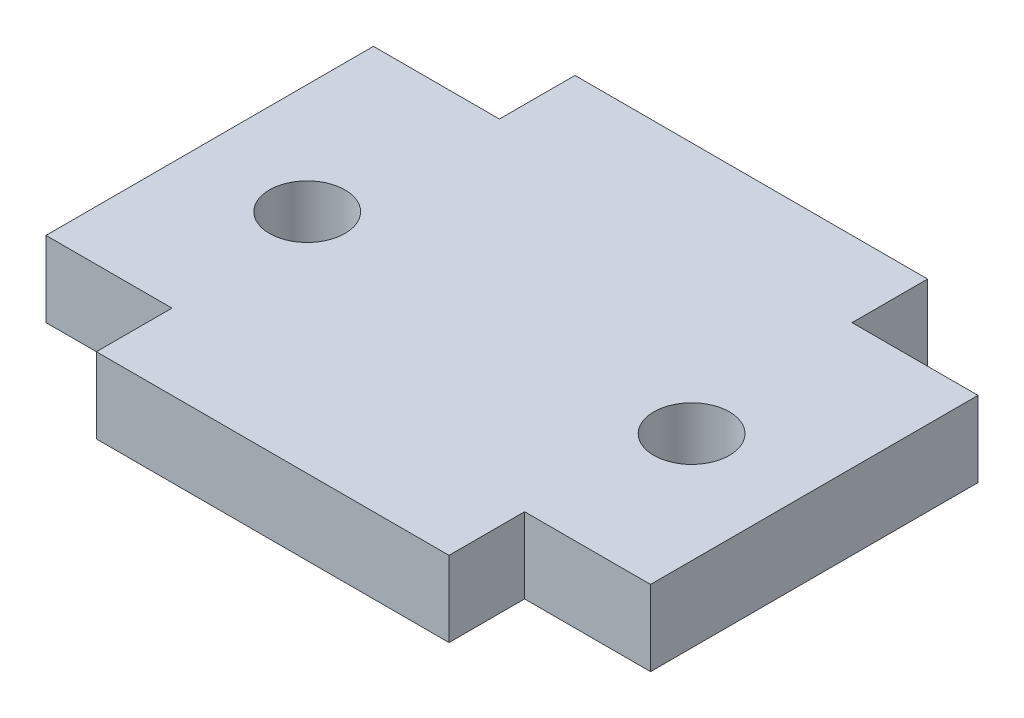
ISO-10303-21;
HEADER;
FILE_DESCRIPTION(('STEP AP214'),'2;1');
FILE_NAME('part.step','',(''),(''),'','','');
FILE_SCHEMA(('AUTOMOTIVE_DESIGN { 1 0 10303 214 1 1 1 1 }'));
ENDSEC;
DATA;
#1=APPLICATION_CONTEXT('core data for automotive mechanical design processes');
#2=APPLICATION_PROTOCOL_DEFINITION('international standard','automotive_design',2000,#1);
#3=PRODUCT_CONTEXT('',#1,'mechanical');
#4=PRODUCT('Part','Part','',(#3));
#5=PRODUCT_RELATED_PRODUCT_CATEGORY('part','',(#4));
#6=PRODUCT_DEFINITION_FORMATION('','',#4);
#7=PRODUCT_DEFINITION_CONTEXT('part definition',#1,'design');
#8=PRODUCT_DEFINITION('design','',#6,#7);
#9=PRODUCT_DEFINITION_SHAPE('','',#8);
#10=(LENGTH_UNIT() NAMED_UNIT(*) SI_UNIT(.MILLI.,.METRE.));
#11=(NAMED_UNIT(*) PLANE_ANGLE_UNIT() SI_UNIT($,.RADIAN.));
#12=(NAMED_UNIT(*) SI_UNIT($,.STERADIAN.) SOLID_ANGLE_UNIT());
#13=UNCERTAINTY_MEASURE_WITH_UNIT(LENGTH_MEASURE(1.E-05),#10,'distance_accuracy_value','');
#14=(GEOMETRIC_REPRESENTATION_CONTEXT(3) GLOBAL_UNCERTAINTY_ASSIGNED_CONTEXT((#13)) GLOBAL_UNIT_ASSIGNED_CONTEXT((#10,
#11,#12)) REPRESENTATION_CONTEXT('',''));
#15=CARTESIAN_POINT('',(0.,0.,0.));
#16=DIRECTION('',(0.,0.,1.));
#17=DIRECTION('',(1.,0.,0.));
#18=AXIS2_PLACEMENT_3D('',#15,#16,#17);
#19=CARTESIAN_POINT('',(0.,3.,0.));
#20=DIRECTION('',(0.,-1.,0.));
#21=DIRECTION('',(0.,0.,-1.));
#22=AXIS2_PLACEMENT_3D('',#19,#20,#21);
#23=PLANE('',#22);
#24=DIRECTION('',(1.,0.,0.));
#25=VECTOR('',#24,1.);
#26=CARTESIAN_POINT('',(5.,3.,0.));
#27=LINE('',#26,#25);
#28=CARTESIAN_POINT('',(0.,3.,0.));
#29=VERTEX_POINT('',#28);
#30=CARTESIAN_POINT('',(5.,3.,0.));
#31=VERTEX_POINT('',#30);
#32=EDGE_CURVE('E176',#29,#31,#27,.T.);
#33=ORIENTED_EDGE('',*,*,#32,.T.);
#34=DIRECTION('',(0.,0.,1.));
#35=VECTOR('',#34,1.);
#36=CARTESIAN_POINT('',(5.,3.,3.));
#37=LINE('',#36,#35);
#38=CARTESIAN_POINT('',(5.,3.,3.));
#39=VERTEX_POINT('',#38);
#40=EDGE_CURVE('E104',#31,#39,#37,.T.);
#41=ORIENTED_EDGE('',*,*,#40,.T.);
#42=DIRECTION('',(1.,0.,0.));
#43=VECTOR('',#42,1.);
#44=CARTESIAN_POINT('',(5.,3.,3.));
#45=LINE('',#44,#43);
#46=CARTESIAN_POINT('',(19.,3.,3.));
#47=VERTEX_POINT('',#46);
#48=EDGE_CURVE('E203',#39,#47,#45,.T.);
#49=ORIENTED_EDGE('',*,*,#48,.T.);
#50=DIRECTION('',(0.,0.,-1.));
#51=VECTOR('',#50,1.);
#52=CARTESIAN_POINT('',(19.,3.,3.));
#53=LINE('',#52,#51);
#54=CARTESIAN_POINT('',(19.,3.,0.));
#55=VERTEX_POINT('',#54);
#56=EDGE_CURVE('E222',#47,#55,#53,.T.);
#57=ORIENTED_EDGE('',*,*,#56,.T.);
#58=DIRECTION('',(1.,0.,0.));
#59=VECTOR('',#58,1.);
#60=CARTESIAN_POINT('',(24.,3.,0.));
#61=LINE('',#60,#59);
#62=CARTESIAN_POINT('',(24.,3.,0.));
#63=VERTEX_POINT('',#62);
#64=EDGE_CURVE('E219',#55,#63,#61,.T.);
#65=ORIENTED_EDGE('',*,*,#64,.T.);
#66=DIRECTION('',(0.,0.,-1.));
#67=VECTOR('',#66,1.);
#68=CARTESIAN_POINT('',(24.,3.,-13.));
#69=LINE('',#68,#67);
#70=CARTESIAN_POINT('',(24.,3.,-13.));
#71=VERTEX_POINT('',#70);
#72=EDGE_CURVE('E221',#63,#71,#69,.T.);
#73=ORIENTED_EDGE('',*,*,#72,.T.);
#74=DIRECTION('',(-1.,0.,0.));
#75=VECTOR('',#74,1.);
#76=CARTESIAN_POINT('',(19.,3.,-13.));
#77=LINE('',#76,#75);
#78=CARTESIAN_POINT('',(19.,3.,-13.));
#79=VERTEX_POINT('',#78);
#80=EDGE_CURVE('E224',#71,#79,#77,.T.);
#81=ORIENTED_EDGE('',*,*,#80,.T.);
#82=DIRECTION('',(0.,0.,-1.));
#83=VECTOR('',#82,1.);
#84=CARTESIAN_POINT('',(19.,3.,-16.));
#85=LINE('',#84,#83);
#86=CARTESIAN_POINT('',(19.,3.,-16.));
#87=VERTEX_POINT('',#86);
#88=EDGE_CURVE('E230',#79,#87,#85,.T.);
#89=ORIENTED_EDGE('',*,*,#88,.T.);
#90=DIRECTION('',(-1.,0.,0.));
#91=VECTOR('',#90,1.);
#92=CARTESIAN_POINT('',(5.,3.,-16.));
#93=LINE('',#92,#91);
#94=CARTESIAN_POINT('',(5.,3.,-16.));
#95=VERTEX_POINT('',#94);
#96=EDGE_CURVE('E135',#87,#95,#93,.T.);
#97=ORIENTED_EDGE('',*,*,#96,.T.);
#98=DIRECTION('',(0.,0.,1.));
#99=VECTOR('',#98,1.);
#100=CARTESIAN_POINT('',(5.,3.,-16.));
#101=LINE('',#100,#99);
#102=CARTESIAN_POINT('',(5.,3.,-13.));
#103=VERTEX_POINT('',#102);
#104=EDGE_CURVE('E129',#95,#103,#101,.T.);
#105=ORIENTED_EDGE('',*,*,#104,.T.);
#106=DIRECTION('',(-1.,0.,0.));
#107=VECTOR('',#106,1.);
#108=CARTESIAN_POINT('',(0.,3.,-13.));
#109=LINE('',#108,#107);
#110=CARTESIAN_POINT('',(0.,3.,-13.));
#111=VERTEX_POINT('',#110);
#112=EDGE_CURVE('E133',#103,#111,#109,.T.);
#113=ORIENTED_EDGE('',*,*,#112,.T.);
#114=DIRECTION('',(0.,0.,1.));
#115=VECTOR('',#114,1.);
#116=CARTESIAN_POINT('',(0.,3.,0.));
#117=LINE('',#116,#115);
#118=EDGE_CURVE('E49',#111,#29,#117,.T.);
#119=ORIENTED_EDGE('',*,*,#118,.T.);
#120=EDGE_LOOP('',(#33,#41,#49,#57,#65,#73,#81,#89,#97,#105,#113,#119));
#121=FACE_BOUND('',#120,.T.);
#122=CARTESIAN_POINT('',(4.37,3.,-6.));
#123=DIRECTION('',(0.,1.,0.));
#124=DIRECTION('',(0.,0.,1.));
#125=AXIS2_PLACEMENT_3D('',#122,#123,#124);
#126=CIRCLE('',#125,1.5);
#127=CARTESIAN_POINT('',(4.37,3.,-4.5));
#128=VERTEX_POINT('',#127);
#129=EDGE_CURVE('E157',#128,#128,#126,.T.);
#130=ORIENTED_EDGE('',*,*,#129,.F.);
#131=EDGE_LOOP('',(#130));
#132=FACE_BOUND('',#131,.T.);
#133=CARTESIAN_POINT('',(19.63,3.,-6.));
#134=DIRECTION('',(0.,1.,0.));
#135=DIRECTION('',(0.,0.,-1.));
#136=AXIS2_PLACEMENT_3D('',#133,#134,#135);
#137=CIRCLE('',#136,1.5);
#138=CARTESIAN_POINT('',(19.63,3.,-7.5));
#139=VERTEX_POINT('',#138);
#140=EDGE_CURVE('E271',#139,#139,#137,.T.);
#141=ORIENTED_EDGE('',*,*,#140,.F.);
#142=EDGE_LOOP('',(#141));
#143=FACE_BOUND('',#142,.T.);
#144=ADVANCED_FACE('F32',(#121,#132,#143),#23,.F.);
#145=CARTESIAN_POINT('',(0.,0.,0.));
#146=DIRECTION('',(0.,-1.,0.));
#147=DIRECTION('',(0.,0.,-1.));
#148=AXIS2_PLACEMENT_3D('',#145,#146,#147);
#149=PLANE('',#148);
#150=CARTESIAN_POINT('',(4.37,0.,-6.));
#151=DIRECTION('',(0.,1.,0.));
#152=DIRECTION('',(0.,0.,1.));
#153=AXIS2_PLACEMENT_3D('',#150,#151,#152);
#154=CIRCLE('',#153,1.5);
#155=CARTESIAN_POINT('',(4.37,0.,-4.5));
#156=VERTEX_POINT('',#155);
#157=EDGE_CURVE('E276',#156,#156,#154,.T.);
#158=ORIENTED_EDGE('',*,*,#157,.T.);
#159=EDGE_LOOP('',(#158));
#160=FACE_BOUND('',#159,.T.);
#161=DIRECTION('',(1.,0.,0.));
#162=VECTOR('',#161,1.);
#163=CARTESIAN_POINT('',(5.,0.,0.));
#164=LINE('',#163,#162);
#165=CARTESIAN_POINT('',(0.,0.,0.));
#166=VERTEX_POINT('',#165);
#167=CARTESIAN_POINT('',(5.,0.,0.));
#168=VERTEX_POINT('',#167);
#169=EDGE_CURVE('E153',#166,#168,#164,.T.);
#170=ORIENTED_EDGE('',*,*,#169,.F.);
#171=DIRECTION('',(0.,0.,1.));
#172=VECTOR('',#171,1.);
#173=CARTESIAN_POINT('',(0.,0.,0.));
#174=LINE('',#173,#172);
#175=CARTESIAN_POINT('',(0.,0.,-13.));
#176=VERTEX_POINT('',#175);
#177=EDGE_CURVE('E96',#176,#166,#174,.T.);
#178=ORIENTED_EDGE('',*,*,#177,.F.);
#179=DIRECTION('',(-1.,0.,0.));
#180=VECTOR('',#179,1.);
#181=CARTESIAN_POINT('',(0.,0.,-13.));
#182=LINE('',#181,#180);
#183=CARTESIAN_POINT('',(5.,0.,-13.));
#184=VERTEX_POINT('',#183);
#185=EDGE_CURVE('E90',#184,#176,#182,.T.);
#186=ORIENTED_EDGE('',*,*,#185,.F.);
#187=DIRECTION('',(0.,0.,1.));
#188=VECTOR('',#187,1.);
#189=CARTESIAN_POINT('',(5.,0.,-16.));
#190=LINE('',#189,#188);
#191=CARTESIAN_POINT('',(5.,0.,-16.));
#192=VERTEX_POINT('',#191);
#193=EDGE_CURVE('E143',#192,#184,#190,.T.);
#194=ORIENTED_EDGE('',*,*,#193,.F.);
#195=DIRECTION('',(-1.,0.,0.));
#196=VECTOR('',#195,1.);
#197=CARTESIAN_POINT('',(5.,0.,-16.));
#198=LINE('',#197,#196);
#199=CARTESIAN_POINT('',(19.,0.,-16.));
#200=VERTEX_POINT('',#199);
#201=EDGE_CURVE('E171',#200,#192,#198,.T.);
#202=ORIENTED_EDGE('',*,*,#201,.F.);
#203=DIRECTION('',(0.,0.,-1.));
#204=VECTOR('',#203,1.);
#205=CARTESIAN_POINT('',(19.,0.,-16.));
#206=LINE('',#205,#204);
#207=CARTESIAN_POINT('',(19.,0.,-13.));
#208=VERTEX_POINT('',#207);
#209=EDGE_CURVE('E169',#208,#200,#206,.T.);
#210=ORIENTED_EDGE('',*,*,#209,.F.);
#211=DIRECTION('',(-1.,0.,0.));
#212=VECTOR('',#211,1.);
#213=CARTESIAN_POINT('',(19.,0.,-13.));
#214=LINE('',#213,#212);
#215=CARTESIAN_POINT('',(24.,0.,-13.));
#216=VERTEX_POINT('',#215);
#217=EDGE_CURVE('E167',#216,#208,#214,.T.);
#218=ORIENTED_EDGE('',*,*,#217,.F.);
#219=DIRECTION('',(0.,0.,-1.));
#220=VECTOR('',#219,1.);
#221=CARTESIAN_POINT('',(24.,0.,-13.));
#222=LINE('',#221,#220);
#223=CARTESIAN_POINT('',(24.,0.,0.));
#224=VERTEX_POINT('',#223);
#225=EDGE_CURVE('E165',#224,#216,#222,.T.);
#226=ORIENTED_EDGE('',*,*,#225,.F.);
#227=DIRECTION('',(1.,0.,0.));
#228=VECTOR('',#227,1.);
#229=CARTESIAN_POINT('',(24.,0.,0.));
#230=LINE('',#229,#228);
#231=CARTESIAN_POINT('',(19.,0.,0.));
#232=VERTEX_POINT('',#231);
#233=EDGE_CURVE('E163',#232,#224,#230,.T.);
#234=ORIENTED_EDGE('',*,*,#233,.F.);
#235=DIRECTION('',(0.,0.,-1.));
#236=VECTOR('',#235,1.);
#237=CARTESIAN_POINT('',(19.,0.,3.));
#238=LINE('',#237,#236);
#239=CARTESIAN_POINT('',(19.,0.,3.));
#240=VERTEX_POINT('',#239);
#241=EDGE_CURVE('E161',#240,#232,#238,.T.);
#242=ORIENTED_EDGE('',*,*,#241,.F.);
#243=DIRECTION('',(1.,0.,0.));
#244=VECTOR('',#243,1.);
#245=CARTESIAN_POINT('',(5.,0.,3.));
#246=LINE('',#245,#244);
#247=CARTESIAN_POINT('',(5.,0.,3.));
#248=VERTEX_POINT('',#247);
#249=EDGE_CURVE('E159',#248,#240,#246,.T.);
#250=ORIENTED_EDGE('',*,*,#249,.F.);
#251=DIRECTION('',(0.,0.,1.));
#252=VECTOR('',#251,1.);
#253=CARTESIAN_POINT('',(5.,0.,3.));
#254=LINE('',#253,#252);
#255=EDGE_CURVE('E156',#168,#248,#254,.T.);
#256=ORIENTED_EDGE('',*,*,#255,.F.);
#257=EDGE_LOOP('',(#170,#178,#186,#194,#202,#210,#218,#226,#234,#242,#250,#256));
#258=FACE_BOUND('',#257,.T.);
#259=CARTESIAN_POINT('',(19.63,0.,-6.));
#260=DIRECTION('',(0.,1.,0.));
#261=DIRECTION('',(0.,0.,-1.));
#262=AXIS2_PLACEMENT_3D('',#259,#260,#261);
#263=CIRCLE('',#262,1.5);
#264=CARTESIAN_POINT('',(19.63,0.,-7.5));
#265=VERTEX_POINT('',#264);
#266=EDGE_CURVE('E274',#265,#265,#263,.T.);
#267=ORIENTED_EDGE('',*,*,#266,.T.);
#268=EDGE_LOOP('',(#267));
#269=FACE_BOUND('',#268,.T.);
#270=ADVANCED_FACE('F207',(#160,#258,#269),#149,.T.);
#271=CARTESIAN_POINT('',(5.,3.,0.));
#272=DIRECTION('',(0.,0.,-1.));
#273=DIRECTION('',(-1.,0.,0.));
#274=AXIS2_PLACEMENT_3D('',#271,#272,#273);
#275=PLANE('',#274);
#276=ORIENTED_EDGE('',*,*,#169,.T.);
#277=DIRECTION('',(0.,-1.,0.));
#278=VECTOR('',#277,1.);
#279=CARTESIAN_POINT('',(5.,3.,0.));
#280=LINE('',#279,#278);
#281=EDGE_CURVE('E11',#31,#168,#280,.T.);
#282=ORIENTED_EDGE('',*,*,#281,.F.);
#283=ORIENTED_EDGE('',*,*,#32,.F.);
#284=DIRECTION('',(0.,-1.,0.));
#285=VECTOR('',#284,1.);
#286=CARTESIAN_POINT('',(0.,3.,0.));
#287=LINE('',#286,#285);
#288=EDGE_CURVE('E149',#29,#166,#287,.T.);
#289=ORIENTED_EDGE('',*,*,#288,.T.);
#290=EDGE_LOOP('',(#276,#282,#283,#289));
#291=FACE_BOUND('',#290,.T.);
#292=ADVANCED_FACE('F34',(#291),#275,.F.);
#293=CARTESIAN_POINT('',(5.,3.,3.));
#294=DIRECTION('',(1.,0.,0.));
#295=DIRECTION('',(0.,0.,-1.));
#296=AXIS2_PLACEMENT_3D('',#293,#294,#295);
#297=PLANE('',#296);
#298=ORIENTED_EDGE('',*,*,#255,.T.);
#299=DIRECTION('',(0.,-1.,0.));
#300=VECTOR('',#299,1.);
#301=CARTESIAN_POINT('',(5.,3.,3.));
#302=LINE('',#301,#300);
#303=EDGE_CURVE('E41',#39,#248,#302,.T.);
#304=ORIENTED_EDGE('',*,*,#303,.F.);
#305=ORIENTED_EDGE('',*,*,#40,.F.);
#306=ORIENTED_EDGE('',*,*,#281,.T.);
#307=EDGE_LOOP('',(#298,#304,#305,#306));
#308=FACE_BOUND('',#307,.T.);
#309=ADVANCED_FACE('F371',(#308),#297,.F.);
#310=CARTESIAN_POINT('',(5.,3.,3.));
#311=DIRECTION('',(0.,0.,-1.));
#312=DIRECTION('',(-1.,0.,0.));
#313=AXIS2_PLACEMENT_3D('',#310,#311,#312);
#314=PLANE('',#313);
#315=ORIENTED_EDGE('',*,*,#249,.T.);
#316=DIRECTION('',(0.,-1.,0.));
#317=VECTOR('',#316,1.);
#318=CARTESIAN_POINT('',(19.,3.,3.));
#319=LINE('',#318,#317);
#320=EDGE_CURVE('E195',#47,#240,#319,.T.);
#321=ORIENTED_EDGE('',*,*,#320,.F.);
#322=ORIENTED_EDGE('',*,*,#48,.F.);
#323=ORIENTED_EDGE('',*,*,#303,.T.);
#324=EDGE_LOOP('',(#315,#321,#322,#323));
#325=FACE_BOUND('',#324,.T.);
#326=ADVANCED_FACE('F201',(#325),#314,.F.);
#327=CARTESIAN_POINT('',(19.,3.,3.));
#328=DIRECTION('',(-1.,0.,0.));
#329=DIRECTION('',(0.,0.,1.));
#330=AXIS2_PLACEMENT_3D('',#327,#328,#329);
#331=PLANE('',#330);
#332=ORIENTED_EDGE('',*,*,#241,.T.);
#333=DIRECTION('',(0.,-1.,0.));
#334=VECTOR('',#333,1.);
#335=CARTESIAN_POINT('',(19.,3.,0.));
#336=LINE('',#335,#334);
#337=EDGE_CURVE('E192',#55,#232,#336,.T.);
#338=ORIENTED_EDGE('',*,*,#337,.F.);
#339=ORIENTED_EDGE('',*,*,#56,.F.);
#340=ORIENTED_EDGE('',*,*,#320,.T.);
#341=EDGE_LOOP('',(#332,#338,#339,#340));
#342=FACE_BOUND('',#341,.T.);
#343=ADVANCED_FACE('F213',(#342),#331,.F.);
#344=CARTESIAN_POINT('',(24.,3.,0.));
#345=DIRECTION('',(0.,0.,-1.));
#346=DIRECTION('',(-1.,0.,0.));
#347=AXIS2_PLACEMENT_3D('',#344,#345,#346);
#348=PLANE('',#347);
#349=ORIENTED_EDGE('',*,*,#233,.T.);
#350=DIRECTION('',(0.,-1.,0.));
#351=VECTOR('',#350,1.);
#352=CARTESIAN_POINT('',(24.,3.,0.));
#353=LINE('',#352,#351);
#354=EDGE_CURVE('E189',#63,#224,#353,.T.);
#355=ORIENTED_EDGE('',*,*,#354,.F.);
#356=ORIENTED_EDGE('',*,*,#64,.F.);
#357=ORIENTED_EDGE('',*,*,#337,.T.);
#358=EDGE_LOOP('',(#349,#355,#356,#357));
#359=FACE_BOUND('',#358,.T.);
#360=ADVANCED_FACE('F217',(#359),#348,.F.);
#361=CARTESIAN_POINT('',(24.,3.,-13.));
#362=DIRECTION('',(-1.,0.,0.));
#363=DIRECTION('',(0.,0.,1.));
#364=AXIS2_PLACEMENT_3D('',#361,#362,#363);
#365=PLANE('',#364);
#366=ORIENTED_EDGE('',*,*,#225,.T.);
#367=DIRECTION('',(0.,-1.,0.));
#368=VECTOR('',#367,1.);
#369=CARTESIAN_POINT('',(24.,3.,-13.));
#370=LINE('',#369,#368);
#371=EDGE_CURVE('E186',#71,#216,#370,.T.);
#372=ORIENTED_EDGE('',*,*,#371,.F.);
#373=ORIENTED_EDGE('',*,*,#72,.F.);
#374=ORIENTED_EDGE('',*,*,#354,.T.);
#375=EDGE_LOOP('',(#366,#372,#373,#374));
#376=FACE_BOUND('',#375,.T.);
#377=ADVANCED_FACE('F336',(#376),#365,.F.);
#378=CARTESIAN_POINT('',(19.,3.,-13.));
#379=DIRECTION('',(0.,0.,1.));
#380=DIRECTION('',(1.,0.,0.));
#381=AXIS2_PLACEMENT_3D('',#378,#379,#380);
#382=PLANE('',#381);
#383=ORIENTED_EDGE('',*,*,#217,.T.);
#384=DIRECTION('',(0.,-1.,0.));
#385=VECTOR('',#384,1.);
#386=CARTESIAN_POINT('',(19.,3.,-13.));
#387=LINE('',#386,#385);
#388=EDGE_CURVE('E183',#79,#208,#387,.T.);
#389=ORIENTED_EDGE('',*,*,#388,.F.);
#390=ORIENTED_EDGE('',*,*,#80,.F.);
#391=ORIENTED_EDGE('',*,*,#371,.T.);
#392=EDGE_LOOP('',(#383,#389,#390,#391));
#393=FACE_BOUND('',#392,.T.);
#394=ADVANCED_FACE('F327',(#393),#382,.F.);
#395=CARTESIAN_POINT('',(19.,3.,-16.));
#396=DIRECTION('',(-1.,0.,0.));
#397=DIRECTION('',(0.,0.,1.));
#398=AXIS2_PLACEMENT_3D('',#395,#396,#397);
#399=PLANE('',#398);
#400=ORIENTED_EDGE('',*,*,#209,.T.);
#401=DIRECTION('',(0.,-1.,0.));
#402=VECTOR('',#401,1.);
#403=CARTESIAN_POINT('',(19.,3.,-16.));
#404=LINE('',#403,#402);
#405=EDGE_CURVE('E180',#87,#200,#404,.T.);
#406=ORIENTED_EDGE('',*,*,#405,.F.);
#407=ORIENTED_EDGE('',*,*,#88,.F.);
#408=ORIENTED_EDGE('',*,*,#388,.T.);
#409=EDGE_LOOP('',(#400,#406,#407,#408));
#410=FACE_BOUND('',#409,.T.);
#411=ADVANCED_FACE('F236',(#410),#399,.F.);
#412=CARTESIAN_POINT('',(5.,3.,-16.));
#413=DIRECTION('',(0.,0.,1.));
#414=DIRECTION('',(1.,0.,0.));
#415=AXIS2_PLACEMENT_3D('',#412,#413,#414);
#416=PLANE('',#415);
#417=ORIENTED_EDGE('',*,*,#201,.T.);
#418=DIRECTION('',(0.,-1.,0.));
#419=VECTOR('',#418,1.);
#420=CARTESIAN_POINT('',(5.,3.,-16.));
#421=LINE('',#420,#419);
#422=EDGE_CURVE('E144',#95,#192,#421,.T.);
#423=ORIENTED_EDGE('',*,*,#422,.F.);
#424=ORIENTED_EDGE('',*,*,#96,.F.);
#425=ORIENTED_EDGE('',*,*,#405,.T.);
#426=EDGE_LOOP('',(#417,#423,#424,#425));
#427=FACE_BOUND('',#426,.T.);
#428=ADVANCED_FACE('F240',(#427),#416,.F.);
#429=CARTESIAN_POINT('',(5.,3.,-16.));
#430=DIRECTION('',(1.,0.,0.));
#431=DIRECTION('',(0.,0.,-1.));
#432=AXIS2_PLACEMENT_3D('',#429,#430,#431);
#433=PLANE('',#432);
#434=ORIENTED_EDGE('',*,*,#193,.T.);
#435=DIRECTION('',(0.,-1.,0.));
#436=VECTOR('',#435,1.);
#437=CARTESIAN_POINT('',(5.,3.,-13.));
#438=LINE('',#437,#436);
#439=EDGE_CURVE('E140',#103,#184,#438,.T.);
#440=ORIENTED_EDGE('',*,*,#439,.F.);
#441=ORIENTED_EDGE('',*,*,#104,.F.);
#442=ORIENTED_EDGE('',*,*,#422,.T.);
#443=EDGE_LOOP('',(#434,#440,#441,#442));
#444=FACE_BOUND('',#443,.T.);
#445=ADVANCED_FACE('F141',(#444),#433,.F.);
#446=CARTESIAN_POINT('',(0.,3.,-13.));
#447=DIRECTION('',(0.,0.,1.));
#448=DIRECTION('',(1.,0.,0.));
#449=AXIS2_PLACEMENT_3D('',#446,#447,#448);
#450=PLANE('',#449);
#451=ORIENTED_EDGE('',*,*,#185,.T.);
#452=DIRECTION('',(0.,-1.,0.));
#453=VECTOR('',#452,1.);
#454=CARTESIAN_POINT('',(0.,3.,-13.));
#455=LINE('',#454,#453);
#456=EDGE_CURVE('E145',#111,#176,#455,.T.);
#457=ORIENTED_EDGE('',*,*,#456,.F.);
#458=ORIENTED_EDGE('',*,*,#112,.F.);
#459=ORIENTED_EDGE('',*,*,#439,.T.);
#460=EDGE_LOOP('',(#451,#457,#458,#459));
#461=FACE_BOUND('',#460,.T.);
#462=ADVANCED_FACE('F147',(#461),#450,.F.);
#463=CARTESIAN_POINT('',(0.,3.,0.));
#464=DIRECTION('',(1.,0.,0.));
#465=DIRECTION('',(0.,0.,-1.));
#466=AXIS2_PLACEMENT_3D('',#463,#464,#465);
#467=PLANE('',#466);
#468=ORIENTED_EDGE('',*,*,#177,.T.);
#469=ORIENTED_EDGE('',*,*,#288,.F.);
#470=ORIENTED_EDGE('',*,*,#118,.F.);
#471=ORIENTED_EDGE('',*,*,#456,.T.);
#472=EDGE_LOOP('',(#468,#469,#470,#471));
#473=FACE_BOUND('',#472,.T.);
#474=ADVANCED_FACE('F244',(#473),#467,.F.);
#475=CARTESIAN_POINT('',(4.37,3.,-6.));
#476=DIRECTION('',(0.,-1.,0.));
#477=DIRECTION('',(0.,0.,-1.));
#478=AXIS2_PLACEMENT_3D('',#475,#476,#477);
#479=CYLINDRICAL_SURFACE('',#478,1.5);
#480=ORIENTED_EDGE('',*,*,#129,.T.);
#481=EDGE_LOOP('',(#480));
#482=FACE_BOUND('',#481,.T.);
#483=ORIENTED_EDGE('',*,*,#157,.F.);
#484=EDGE_LOOP('',(#483));
#485=FACE_BOUND('',#484,.T.);
#486=ADVANCED_FACE('F246',(#482,#485),#479,.F.);
#487=CARTESIAN_POINT('',(19.63,3.,-6.));
#488=DIRECTION('',(0.,-1.,0.));
#489=DIRECTION('',(0.,0.,-1.));
#490=AXIS2_PLACEMENT_3D('',#487,#488,#489);
#491=CYLINDRICAL_SURFACE('',#490,1.5);
#492=ORIENTED_EDGE('',*,*,#140,.T.);
#493=EDGE_LOOP('',(#492));
#494=FACE_BOUND('',#493,.T.);
#495=ORIENTED_EDGE('',*,*,#266,.F.);
#496=EDGE_LOOP('',(#495));
#497=FACE_BOUND('',#496,.T.);
#498=ADVANCED_FACE('F252',(#494,#497),#491,.F.);
#499=CLOSED_SHELL('',(#144,#270,#292,#309,#326,#343,#360,#377,#394,#411,#428,#445,#462,#474,
#486,#498));
#500=MANIFOLD_SOLID_BREP('B2',#499);
#501=ADVANCED_BREP_SHAPE_REPRESENTATION('',(#18,#500),#14);
#502=SHAPE_DEFINITION_REPRESENTATION(#9,#501);
ENDSEC;
END-ISO-10303-21;
